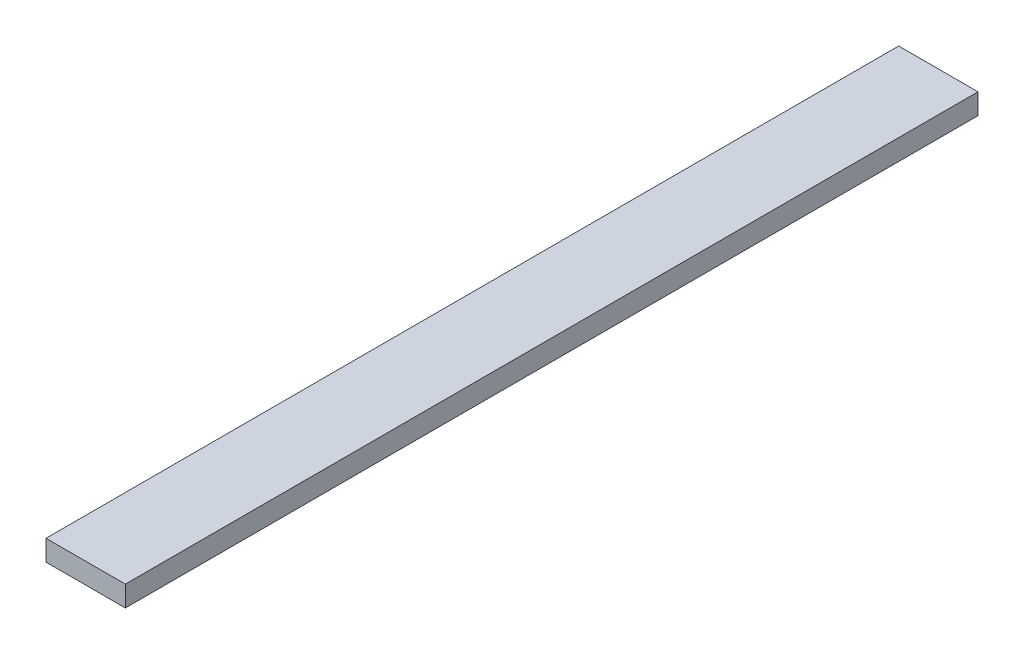
ISO-10303-21;
HEADER;
FILE_DESCRIPTION(('STEP AP214'),'2;1');
FILE_NAME('part.step','',(''),(''),'','','');
FILE_SCHEMA(('AUTOMOTIVE_DESIGN { 1 0 10303 214 1 1 1 1 }'));
ENDSEC;
DATA;
#1=APPLICATION_CONTEXT('core data for automotive mechanical design processes');
#2=APPLICATION_PROTOCOL_DEFINITION('international standard','automotive_design',2000,#1);
#3=PRODUCT_CONTEXT('',#1,'mechanical');
#4=PRODUCT('Part','Part','',(#3));
#5=PRODUCT_RELATED_PRODUCT_CATEGORY('part','',(#4));
#6=PRODUCT_DEFINITION_FORMATION('','',#4);
#7=PRODUCT_DEFINITION_CONTEXT('part definition',#1,'design');
#8=PRODUCT_DEFINITION('design','',#6,#7);
#9=PRODUCT_DEFINITION_SHAPE('','',#8);
#10=(LENGTH_UNIT() NAMED_UNIT(*) SI_UNIT(.MILLI.,.METRE.));
#11=(NAMED_UNIT(*) PLANE_ANGLE_UNIT() SI_UNIT($,.RADIAN.));
#12=(NAMED_UNIT(*) SI_UNIT($,.STERADIAN.) SOLID_ANGLE_UNIT());
#13=UNCERTAINTY_MEASURE_WITH_UNIT(LENGTH_MEASURE(1.E-05),#10,'distance_accuracy_value','');
#14=(GEOMETRIC_REPRESENTATION_CONTEXT(3) GLOBAL_UNCERTAINTY_ASSIGNED_CONTEXT((#13)) GLOBAL_UNIT_ASSIGNED_CONTEXT((#10,
#11,#12)) REPRESENTATION_CONTEXT('',''));
#15=CARTESIAN_POINT('',(0.,0.,0.));
#16=DIRECTION('',(0.,0.,1.));
#17=DIRECTION('',(1.,0.,0.));
#18=AXIS2_PLACEMENT_3D('',#15,#16,#17);
#19=CARTESIAN_POINT('',(0.,6.35,130.822999974));
#20=DIRECTION('',(1.,0.,0.));
#21=DIRECTION('',(0.,0.,-1.));
#22=AXIS2_PLACEMENT_3D('',#19,#20,#21);
#23=PLANE('',#22);
#24=DIRECTION('',(0.,0.,1.));
#25=VECTOR('',#24,1.);
#26=CARTESIAN_POINT('',(0.,0.,130.822999974));
#27=LINE('',#26,#25);
#28=CARTESIAN_POINT('',(0.,0.,-130.822999974));
#29=VERTEX_POINT('',#28);
#30=CARTESIAN_POINT('',(0.,0.,130.822999974));
#31=VERTEX_POINT('',#30);
#32=EDGE_CURVE('E100',#29,#31,#27,.T.);
#33=ORIENTED_EDGE('',*,*,#32,.T.);
#34=DIRECTION('',(0.,-1.,0.));
#35=VECTOR('',#34,1.);
#36=CARTESIAN_POINT('',(0.,6.35,130.822999974));
#37=LINE('',#36,#35);
#38=CARTESIAN_POINT('',(0.,6.35,130.822999974));
#39=VERTEX_POINT('',#38);
#40=EDGE_CURVE('E11',#39,#31,#37,.T.);
#41=ORIENTED_EDGE('',*,*,#40,.F.);
#42=DIRECTION('',(0.,0.,1.));
#43=VECTOR('',#42,1.);
#44=CARTESIAN_POINT('',(0.,6.35,130.822999974));
#45=LINE('',#44,#43);
#46=CARTESIAN_POINT('',(0.,6.35,-130.822999974));
#47=VERTEX_POINT('',#46);
#48=EDGE_CURVE('E88',#47,#39,#45,.T.);
#49=ORIENTED_EDGE('',*,*,#48,.F.);
#50=DIRECTION('',(0.,-1.,0.));
#51=VECTOR('',#50,1.);
#52=CARTESIAN_POINT('',(0.,6.35,-130.822999974));
#53=LINE('',#52,#51);
#54=EDGE_CURVE('E96',#47,#29,#53,.T.);
#55=ORIENTED_EDGE('',*,*,#54,.T.);
#56=EDGE_LOOP('',(#33,#41,#49,#55));
#57=FACE_BOUND('',#56,.T.);
#58=ADVANCED_FACE('F37',(#57),#23,.F.);
#59=CARTESIAN_POINT('',(0.,6.35,130.822999974));
#60=DIRECTION('',(0.,0.,-1.));
#61=DIRECTION('',(-1.,0.,0.));
#62=AXIS2_PLACEMENT_3D('',#59,#60,#61);
#63=PLANE('',#62);
#64=DIRECTION('',(1.,0.,0.));
#65=VECTOR('',#64,1.);
#66=CARTESIAN_POINT('',(0.,0.,130.822999974));
#67=LINE('',#66,#65);
#68=CARTESIAN_POINT('',(24.346000076,0.,130.822999974));
#69=VERTEX_POINT('',#68);
#70=EDGE_CURVE('E92',#31,#69,#67,.T.);
#71=ORIENTED_EDGE('',*,*,#70,.T.);
#72=DIRECTION('',(0.,-1.,0.));
#73=VECTOR('',#72,1.);
#74=CARTESIAN_POINT('',(24.346000076,6.35,130.822999974));
#75=LINE('',#74,#73);
#76=CARTESIAN_POINT('',(24.346000076,6.35,130.822999974));
#77=VERTEX_POINT('',#76);
#78=EDGE_CURVE('E45',#77,#69,#75,.T.);
#79=ORIENTED_EDGE('',*,*,#78,.F.);
#80=DIRECTION('',(1.,0.,0.));
#81=VECTOR('',#80,1.);
#82=CARTESIAN_POINT('',(0.,6.35,130.822999974));
#83=LINE('',#82,#81);
#84=EDGE_CURVE('E83',#39,#77,#83,.T.);
#85=ORIENTED_EDGE('',*,*,#84,.F.);
#86=ORIENTED_EDGE('',*,*,#40,.T.);
#87=EDGE_LOOP('',(#71,#79,#85,#86));
#88=FACE_BOUND('',#87,.T.);
#89=ADVANCED_FACE('F91',(#88),#63,.F.);
#90=CARTESIAN_POINT('',(24.346000076,6.35,130.822999974));
#91=DIRECTION('',(-1.,0.,0.));
#92=DIRECTION('',(0.,0.,1.));
#93=AXIS2_PLACEMENT_3D('',#90,#91,#92);
#94=PLANE('',#93);
#95=DIRECTION('',(0.,0.,-1.));
#96=VECTOR('',#95,1.);
#97=CARTESIAN_POINT('',(24.346000076,0.,130.822999974));
#98=LINE('',#97,#96);
#99=CARTESIAN_POINT('',(24.3460000759999,0.,-130.822999974));
#100=VERTEX_POINT('',#99);
#101=EDGE_CURVE('E70',#69,#100,#98,.T.);
#102=ORIENTED_EDGE('',*,*,#101,.T.);
#103=DIRECTION('',(0.,-1.,0.));
#104=VECTOR('',#103,1.);
#105=CARTESIAN_POINT('',(24.3460000759999,6.35,-130.822999974));
#106=LINE('',#105,#104);
#107=CARTESIAN_POINT('',(24.3460000759999,6.35,-130.822999974));
#108=VERTEX_POINT('',#107);
#109=EDGE_CURVE('E93',#108,#100,#106,.T.);
#110=ORIENTED_EDGE('',*,*,#109,.F.);
#111=DIRECTION('',(0.,0.,-1.));
#112=VECTOR('',#111,1.);
#113=CARTESIAN_POINT('',(24.346000076,6.35,130.822999974));
#114=LINE('',#113,#112);
#115=EDGE_CURVE('E86',#77,#108,#114,.T.);
#116=ORIENTED_EDGE('',*,*,#115,.F.);
#117=ORIENTED_EDGE('',*,*,#78,.T.);
#118=EDGE_LOOP('',(#102,#110,#116,#117));
#119=FACE_BOUND('',#118,.T.);
#120=ADVANCED_FACE('F94',(#119),#94,.F.);
#121=CARTESIAN_POINT('',(0.,6.35,-130.822999974));
#122=DIRECTION('',(0.,0.,1.));
#123=DIRECTION('',(1.,0.,0.));
#124=AXIS2_PLACEMENT_3D('',#121,#122,#123);
#125=PLANE('',#124);
#126=DIRECTION('',(-1.,0.,0.));
#127=VECTOR('',#126,1.);
#128=CARTESIAN_POINT('',(0.,0.,-130.822999974));
#129=LINE('',#128,#127);
#130=EDGE_CURVE('E76',#100,#29,#129,.T.);
#131=ORIENTED_EDGE('',*,*,#130,.T.);
#132=ORIENTED_EDGE('',*,*,#54,.F.);
#133=DIRECTION('',(-1.,0.,0.));
#134=VECTOR('',#133,1.);
#135=CARTESIAN_POINT('',(0.,6.35,-130.822999974));
#136=LINE('',#135,#134);
#137=EDGE_CURVE('E53',#108,#47,#136,.T.);
#138=ORIENTED_EDGE('',*,*,#137,.F.);
#139=ORIENTED_EDGE('',*,*,#109,.T.);
#140=EDGE_LOOP('',(#131,#132,#138,#139));
#141=FACE_BOUND('',#140,.T.);
#142=ADVANCED_FACE('F107',(#141),#125,.F.);
#143=CARTESIAN_POINT('',(0.,6.35,0.));
#144=DIRECTION('',(0.,-1.,0.));
#145=DIRECTION('',(0.,0.,-1.));
#146=AXIS2_PLACEMENT_3D('',#143,#144,#145);
#147=PLANE('',#146);
#148=ORIENTED_EDGE('',*,*,#48,.T.);
#149=ORIENTED_EDGE('',*,*,#84,.T.);
#150=ORIENTED_EDGE('',*,*,#115,.T.);
#151=ORIENTED_EDGE('',*,*,#137,.T.);
#152=EDGE_LOOP('',(#148,#149,#150,#151));
#153=FACE_BOUND('',#152,.T.);
#154=ADVANCED_FACE('F84',(#153),#147,.F.);
#155=CARTESIAN_POINT('',(0.,0.,0.));
#156=DIRECTION('',(0.,-1.,0.));
#157=DIRECTION('',(0.,0.,-1.));
#158=AXIS2_PLACEMENT_3D('',#155,#156,#157);
#159=PLANE('',#158);
#160=ORIENTED_EDGE('',*,*,#32,.F.);
#161=ORIENTED_EDGE('',*,*,#130,.F.);
#162=ORIENTED_EDGE('',*,*,#101,.F.);
#163=ORIENTED_EDGE('',*,*,#70,.F.);
#164=EDGE_LOOP('',(#160,#161,#162,#163));
#165=FACE_BOUND('',#164,.T.);
#166=ADVANCED_FACE('F110',(#165),#159,.T.);
#167=CLOSED_SHELL('',(#58,#89,#120,#142,#154,#166));
#168=MANIFOLD_SOLID_BREP('B2',#167);
#169=ADVANCED_BREP_SHAPE_REPRESENTATION('',(#18,#168),#14);
#170=SHAPE_DEFINITION_REPRESENTATION(#9,#169);
ENDSEC;
END-ISO-10303-21;
